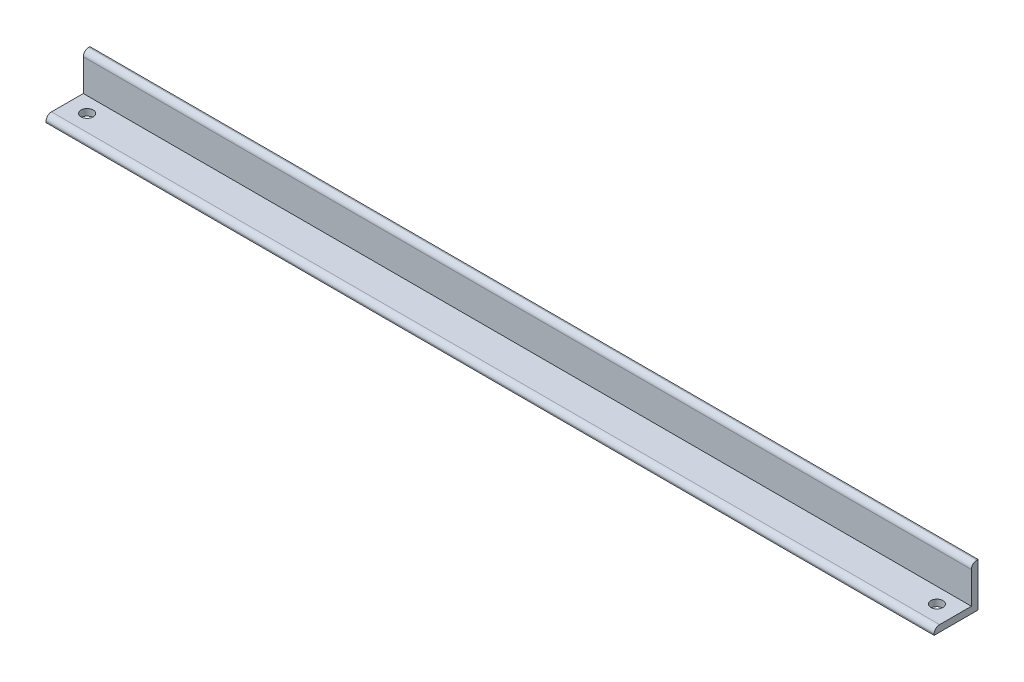
ISO-10303-21;
HEADER;
FILE_DESCRIPTION(('STEP AP214'),'2;1');
FILE_NAME('part.step','',(''),(''),'','','');
FILE_SCHEMA(('AUTOMOTIVE_DESIGN { 1 0 10303 214 1 1 1 1 }'));
ENDSEC;
DATA;
#1=APPLICATION_CONTEXT('core data for automotive mechanical design processes');
#2=APPLICATION_PROTOCOL_DEFINITION('international standard','automotive_design',2000,#1);
#3=PRODUCT_CONTEXT('',#1,'mechanical');
#4=PRODUCT('Part','Part','',(#3));
#5=PRODUCT_RELATED_PRODUCT_CATEGORY('part','',(#4));
#6=PRODUCT_DEFINITION_FORMATION('','',#4);
#7=PRODUCT_DEFINITION_CONTEXT('part definition',#1,'design');
#8=PRODUCT_DEFINITION('design','',#6,#7);
#9=PRODUCT_DEFINITION_SHAPE('','',#8);
#10=(LENGTH_UNIT() NAMED_UNIT(*) SI_UNIT(.MILLI.,.METRE.));
#11=(NAMED_UNIT(*) PLANE_ANGLE_UNIT() SI_UNIT($,.RADIAN.));
#12=(NAMED_UNIT(*) SI_UNIT($,.STERADIAN.) SOLID_ANGLE_UNIT());
#13=UNCERTAINTY_MEASURE_WITH_UNIT(LENGTH_MEASURE(1.E-05),#10,'distance_accuracy_value','');
#14=(GEOMETRIC_REPRESENTATION_CONTEXT(3) GLOBAL_UNCERTAINTY_ASSIGNED_CONTEXT((#13)) GLOBAL_UNIT_ASSIGNED_CONTEXT((#10,
#11,#12)) REPRESENTATION_CONTEXT('',''));
#15=CARTESIAN_POINT('',(0.,0.,0.));
#16=DIRECTION('',(0.,0.,1.));
#17=DIRECTION('',(1.,0.,0.));
#18=AXIS2_PLACEMENT_3D('',#15,#16,#17);
#19=CARTESIAN_POINT('',(0.,0.,80.));
#20=DIRECTION('',(1.,0.,0.));
#21=DIRECTION('',(0.,0.,-1.));
#22=AXIS2_PLACEMENT_3D('',#19,#20,#21);
#23=PLANE('',#22);
#24=DIRECTION('',(0.,-1.,0.));
#25=VECTOR('',#24,1.);
#26=CARTESIAN_POINT('',(0.,0.,80.));
#27=LINE('',#26,#25);
#28=CARTESIAN_POINT('',(0.,2.,80.));
#29=VERTEX_POINT('',#28);
#30=CARTESIAN_POINT('',(0.,0.,80.));
#31=VERTEX_POINT('',#30);
#32=EDGE_CURVE('E126',#29,#31,#27,.T.);
#33=ORIENTED_EDGE('',*,*,#32,.F.);
#34=CARTESIAN_POINT('',(0.,2.,70.));
#35=DIRECTION('',(1.,0.,0.));
#36=DIRECTION('',(0.,0.,-1.));
#37=AXIS2_PLACEMENT_3D('',#34,#35,#36);
#38=CIRCLE('',#37,10.);
#39=CARTESIAN_POINT('',(0.,12.,70.));
#40=VERTEX_POINT('',#39);
#41=EDGE_CURVE('E158',#29,#40,#38,.F.);
#42=ORIENTED_EDGE('',*,*,#41,.T.);
#43=DIRECTION('',(0.,0.,1.));
#44=VECTOR('',#43,1.);
#45=CARTESIAN_POINT('',(0.,12.,12.));
#46=LINE('',#45,#44);
#47=CARTESIAN_POINT('',(0.,12.,12.));
#48=VERTEX_POINT('',#47);
#49=EDGE_CURVE('E105',#48,#40,#46,.T.);
#50=ORIENTED_EDGE('',*,*,#49,.F.);
#51=DIRECTION('',(0.,-1.,0.));
#52=VECTOR('',#51,1.);
#53=CARTESIAN_POINT('',(0.,80.,12.));
#54=LINE('',#53,#52);
#55=CARTESIAN_POINT('',(0.,70.,12.));
#56=VERTEX_POINT('',#55);
#57=EDGE_CURVE('E111',#56,#48,#54,.T.);
#58=ORIENTED_EDGE('',*,*,#57,.F.);
#59=CARTESIAN_POINT('',(0.,70.,2.));
#60=DIRECTION('',(1.,0.,0.));
#61=DIRECTION('',(0.,0.,-1.));
#62=AXIS2_PLACEMENT_3D('',#59,#60,#61);
#63=CIRCLE('',#62,10.);
#64=CARTESIAN_POINT('',(0.,80.,2.));
#65=VERTEX_POINT('',#64);
#66=EDGE_CURVE('E156',#56,#65,#63,.F.);
#67=ORIENTED_EDGE('',*,*,#66,.T.);
#68=DIRECTION('',(0.,0.,-1.));
#69=VECTOR('',#68,1.);
#70=CARTESIAN_POINT('',(0.,80.,80.));
#71=LINE('',#70,#69);
#72=CARTESIAN_POINT('',(0.,80.,0.));
#73=VERTEX_POINT('',#72);
#74=EDGE_CURVE('E134',#65,#73,#71,.T.);
#75=ORIENTED_EDGE('',*,*,#74,.T.);
#76=DIRECTION('',(0.,-1.,0.));
#77=VECTOR('',#76,1.);
#78=CARTESIAN_POINT('',(0.,0.,0.));
#79=LINE('',#78,#77);
#80=CARTESIAN_POINT('',(0.,0.,0.));
#81=VERTEX_POINT('',#80);
#82=EDGE_CURVE('E115',#73,#81,#79,.T.);
#83=ORIENTED_EDGE('',*,*,#82,.T.);
#84=DIRECTION('',(0.,0.,-1.));
#85=VECTOR('',#84,1.);
#86=CARTESIAN_POINT('',(0.,0.,80.));
#87=LINE('',#86,#85);
#88=EDGE_CURVE('E150',#31,#81,#87,.T.);
#89=ORIENTED_EDGE('',*,*,#88,.F.);
#90=EDGE_LOOP('',(#33,#42,#50,#58,#67,#75,#83,#89));
#91=FACE_BOUND('',#90,.T.);
#92=ADVANCED_FACE('F32',(#91),#23,.F.);
#93=CARTESIAN_POINT('',(0.,0.,80.));
#94=DIRECTION('',(0.,1.,0.));
#95=DIRECTION('',(0.,0.,1.));
#96=AXIS2_PLACEMENT_3D('',#93,#94,#95);
#97=PLANE('',#96);
#98=CARTESIAN_POINT('',(1584.01258871579,0.,40.));
#99=DIRECTION('',(0.,-1.,0.));
#100=DIRECTION('',(0.,0.,-1.));
#101=AXIS2_PLACEMENT_3D('',#98,#99,#100);
#102=CIRCLE('',#101,11.);
#103=CARTESIAN_POINT('',(1584.01258871579,0.,29.));
#104=VERTEX_POINT('',#103);
#105=EDGE_CURVE('E172',#104,#104,#102,.T.);
#106=ORIENTED_EDGE('',*,*,#105,.F.);
#107=EDGE_LOOP('',(#106));
#108=FACE_BOUND('',#107,.T.);
#109=CARTESIAN_POINT('',(35.,0.,40.));
#110=DIRECTION('',(0.,-1.,0.));
#111=DIRECTION('',(0.,0.,-1.));
#112=AXIS2_PLACEMENT_3D('',#109,#110,#111);
#113=CIRCLE('',#112,11.);
#114=CARTESIAN_POINT('',(35.,0.,29.));
#115=VERTEX_POINT('',#114);
#116=EDGE_CURVE('E165',#115,#115,#113,.T.);
#117=ORIENTED_EDGE('',*,*,#116,.F.);
#118=EDGE_LOOP('',(#117));
#119=FACE_BOUND('',#118,.T.);
#120=DIRECTION('',(1.,0.,0.));
#121=VECTOR('',#120,1.);
#122=CARTESIAN_POINT('',(0.,0.,0.));
#123=LINE('',#122,#121);
#124=CARTESIAN_POINT('',(1619.,0.,0.));
#125=VERTEX_POINT('',#124);
#126=EDGE_CURVE('E137',#81,#125,#123,.T.);
#127=ORIENTED_EDGE('',*,*,#126,.T.);
#128=DIRECTION('',(0.,0.,-1.));
#129=VECTOR('',#128,1.);
#130=CARTESIAN_POINT('',(1619.,0.,80.));
#131=LINE('',#130,#129);
#132=CARTESIAN_POINT('',(1619.,0.,80.));
#133=VERTEX_POINT('',#132);
#134=EDGE_CURVE('E147',#133,#125,#131,.T.);
#135=ORIENTED_EDGE('',*,*,#134,.F.);
#136=DIRECTION('',(1.,0.,0.));
#137=VECTOR('',#136,1.);
#138=CARTESIAN_POINT('',(0.,0.,80.));
#139=LINE('',#138,#137);
#140=EDGE_CURVE('E128',#31,#133,#139,.T.);
#141=ORIENTED_EDGE('',*,*,#140,.F.);
#142=ORIENTED_EDGE('',*,*,#88,.T.);
#143=EDGE_LOOP('',(#127,#135,#141,#142));
#144=FACE_BOUND('',#143,.T.);
#145=ADVANCED_FACE('F180',(#108,#119,#144),#97,.F.);
#146=CARTESIAN_POINT('',(1619.,0.,80.));
#147=DIRECTION('',(-1.,0.,0.));
#148=DIRECTION('',(0.,0.,1.));
#149=AXIS2_PLACEMENT_3D('',#146,#147,#148);
#150=PLANE('',#149);
#151=DIRECTION('',(0.,0.,1.));
#152=VECTOR('',#151,1.);
#153=CARTESIAN_POINT('',(1619.,12.,12.));
#154=LINE('',#153,#152);
#155=CARTESIAN_POINT('',(1619.,12.,12.));
#156=VERTEX_POINT('',#155);
#157=CARTESIAN_POINT('',(1619.,12.,70.));
#158=VERTEX_POINT('',#157);
#159=EDGE_CURVE('E100',#156,#158,#154,.T.);
#160=ORIENTED_EDGE('',*,*,#159,.T.);
#161=CARTESIAN_POINT('',(1619.,2.,70.));
#162=DIRECTION('',(-1.,0.,0.));
#163=DIRECTION('',(0.,0.,1.));
#164=AXIS2_PLACEMENT_3D('',#161,#162,#163);
#165=CIRCLE('',#164,10.);
#166=CARTESIAN_POINT('',(1619.,2.,80.));
#167=VERTEX_POINT('',#166);
#168=EDGE_CURVE('E162',#158,#167,#165,.F.);
#169=ORIENTED_EDGE('',*,*,#168,.T.);
#170=DIRECTION('',(0.,1.,0.));
#171=VECTOR('',#170,1.);
#172=CARTESIAN_POINT('',(1619.,0.,80.));
#173=LINE('',#172,#171);
#174=EDGE_CURVE('E131',#133,#167,#173,.T.);
#175=ORIENTED_EDGE('',*,*,#174,.F.);
#176=ORIENTED_EDGE('',*,*,#134,.T.);
#177=DIRECTION('',(0.,1.,0.));
#178=VECTOR('',#177,1.);
#179=CARTESIAN_POINT('',(1619.,0.,0.));
#180=LINE('',#179,#178);
#181=CARTESIAN_POINT('',(1619.,80.,0.));
#182=VERTEX_POINT('',#181);
#183=EDGE_CURVE('E139',#125,#182,#180,.T.);
#184=ORIENTED_EDGE('',*,*,#183,.T.);
#185=DIRECTION('',(0.,0.,-1.));
#186=VECTOR('',#185,1.);
#187=CARTESIAN_POINT('',(1619.,80.,80.));
#188=LINE('',#187,#186);
#189=CARTESIAN_POINT('',(1619.,80.,2.));
#190=VERTEX_POINT('',#189);
#191=EDGE_CURVE('E145',#190,#182,#188,.T.);
#192=ORIENTED_EDGE('',*,*,#191,.F.);
#193=CARTESIAN_POINT('',(1619.,70.,2.));
#194=DIRECTION('',(-1.,0.,0.));
#195=DIRECTION('',(0.,0.,1.));
#196=AXIS2_PLACEMENT_3D('',#193,#194,#195);
#197=CIRCLE('',#196,10.);
#198=CARTESIAN_POINT('',(1619.,70.,12.));
#199=VERTEX_POINT('',#198);
#200=EDGE_CURVE('E49',#190,#199,#197,.F.);
#201=ORIENTED_EDGE('',*,*,#200,.T.);
#202=DIRECTION('',(0.,-1.,0.));
#203=VECTOR('',#202,1.);
#204=CARTESIAN_POINT('',(1619.,80.,12.));
#205=LINE('',#204,#203);
#206=EDGE_CURVE('E96',#199,#156,#205,.T.);
#207=ORIENTED_EDGE('',*,*,#206,.T.);
#208=EDGE_LOOP('',(#160,#169,#175,#176,#184,#192,#201,#207));
#209=FACE_BOUND('',#208,.T.);
#210=ADVANCED_FACE('F98',(#209),#150,.F.);
#211=CARTESIAN_POINT('',(0.,80.,80.));
#212=DIRECTION('',(0.,-1.,0.));
#213=DIRECTION('',(0.,0.,-1.));
#214=AXIS2_PLACEMENT_3D('',#211,#212,#213);
#215=PLANE('',#214);
#216=ORIENTED_EDGE('',*,*,#74,.F.);
#217=DIRECTION('',(-1.,0.,0.));
#218=VECTOR('',#217,1.);
#219=CARTESIAN_POINT('',(0.,80.,2.));
#220=LINE('',#219,#218);
#221=EDGE_CURVE('E11',#65,#190,#220,.F.);
#222=ORIENTED_EDGE('',*,*,#221,.T.);
#223=ORIENTED_EDGE('',*,*,#191,.T.);
#224=DIRECTION('',(-1.,0.,0.));
#225=VECTOR('',#224,1.);
#226=CARTESIAN_POINT('',(0.,80.,0.));
#227=LINE('',#226,#225);
#228=EDGE_CURVE('E129',#182,#73,#227,.T.);
#229=ORIENTED_EDGE('',*,*,#228,.T.);
#230=EDGE_LOOP('',(#216,#222,#223,#229));
#231=FACE_BOUND('',#230,.T.);
#232=ADVANCED_FACE('F194',(#231),#215,.F.);
#233=CARTESIAN_POINT('',(0.,80.,80.));
#234=DIRECTION('',(0.,0.,-1.));
#235=DIRECTION('',(-1.,0.,0.));
#236=AXIS2_PLACEMENT_3D('',#233,#234,#235);
#237=PLANE('',#236);
#238=ORIENTED_EDGE('',*,*,#174,.T.);
#239=DIRECTION('',(-1.,0.,0.));
#240=VECTOR('',#239,1.);
#241=CARTESIAN_POINT('',(0.,2.,80.));
#242=LINE('',#241,#240);
#243=EDGE_CURVE('E153',#167,#29,#242,.T.);
#244=ORIENTED_EDGE('',*,*,#243,.T.);
#245=ORIENTED_EDGE('',*,*,#32,.T.);
#246=ORIENTED_EDGE('',*,*,#140,.T.);
#247=EDGE_LOOP('',(#238,#244,#245,#246));
#248=FACE_BOUND('',#247,.T.);
#249=ADVANCED_FACE('F202',(#248),#237,.F.);
#250=CARTESIAN_POINT('',(0.,80.,0.));
#251=DIRECTION('',(0.,0.,-1.));
#252=DIRECTION('',(-1.,0.,0.));
#253=AXIS2_PLACEMENT_3D('',#250,#251,#252);
#254=PLANE('',#253);
#255=ORIENTED_EDGE('',*,*,#82,.F.);
#256=ORIENTED_EDGE('',*,*,#228,.F.);
#257=ORIENTED_EDGE('',*,*,#183,.F.);
#258=ORIENTED_EDGE('',*,*,#126,.F.);
#259=EDGE_LOOP('',(#255,#256,#257,#258));
#260=FACE_BOUND('',#259,.T.);
#261=ADVANCED_FACE('F193',(#260),#254,.T.);
#262=CARTESIAN_POINT('',(1619.,80.,12.));
#263=DIRECTION('',(0.,0.,-1.));
#264=DIRECTION('',(0.,1.,0.));
#265=AXIS2_PLACEMENT_3D('',#262,#263,#264);
#266=PLANE('',#265);
#267=ORIENTED_EDGE('',*,*,#206,.F.);
#268=DIRECTION('',(-1.,0.,0.));
#269=VECTOR('',#268,1.);
#270=CARTESIAN_POINT('',(1619.,70.,12.));
#271=LINE('',#270,#269);
#272=EDGE_CURVE('E41',#199,#56,#271,.T.);
#273=ORIENTED_EDGE('',*,*,#272,.T.);
#274=ORIENTED_EDGE('',*,*,#57,.T.);
#275=DIRECTION('',(-1.,0.,0.));
#276=VECTOR('',#275,1.);
#277=CARTESIAN_POINT('',(1619.,12.,12.));
#278=LINE('',#277,#276);
#279=EDGE_CURVE('E108',#156,#48,#278,.T.);
#280=ORIENTED_EDGE('',*,*,#279,.F.);
#281=EDGE_LOOP('',(#267,#273,#274,#280));
#282=FACE_BOUND('',#281,.T.);
#283=ADVANCED_FACE('F109',(#282),#266,.F.);
#284=CARTESIAN_POINT('',(1619.,12.,12.));
#285=DIRECTION('',(0.,-1.,0.));
#286=DIRECTION('',(0.,0.,-1.));
#287=AXIS2_PLACEMENT_3D('',#284,#285,#286);
#288=PLANE('',#287);
#289=CARTESIAN_POINT('',(1584.01258871579,12.,40.));
#290=DIRECTION('',(0.,-1.,0.));
#291=DIRECTION('',(0.,0.,-1.));
#292=AXIS2_PLACEMENT_3D('',#289,#290,#291);
#293=CIRCLE('',#292,11.);
#294=CARTESIAN_POINT('',(1584.01258871579,12.,29.));
#295=VERTEX_POINT('',#294);
#296=EDGE_CURVE('E36',#295,#295,#293,.T.);
#297=ORIENTED_EDGE('',*,*,#296,.T.);
#298=EDGE_LOOP('',(#297));
#299=FACE_BOUND('',#298,.T.);
#300=CARTESIAN_POINT('',(35.,12.,40.));
#301=DIRECTION('',(0.,-1.,0.));
#302=DIRECTION('',(0.,0.,-1.));
#303=AXIS2_PLACEMENT_3D('',#300,#301,#302);
#304=CIRCLE('',#303,11.);
#305=CARTESIAN_POINT('',(35.,12.,29.));
#306=VERTEX_POINT('',#305);
#307=EDGE_CURVE('E124',#306,#306,#304,.T.);
#308=ORIENTED_EDGE('',*,*,#307,.T.);
#309=EDGE_LOOP('',(#308));
#310=FACE_BOUND('',#309,.T.);
#311=ORIENTED_EDGE('',*,*,#49,.T.);
#312=DIRECTION('',(-1.,0.,0.));
#313=VECTOR('',#312,1.);
#314=CARTESIAN_POINT('',(1619.,12.,70.));
#315=LINE('',#314,#313);
#316=EDGE_CURVE('E119',#40,#158,#315,.F.);
#317=ORIENTED_EDGE('',*,*,#316,.T.);
#318=ORIENTED_EDGE('',*,*,#159,.F.);
#319=ORIENTED_EDGE('',*,*,#279,.T.);
#320=EDGE_LOOP('',(#311,#317,#318,#319));
#321=FACE_BOUND('',#320,.T.);
#322=ADVANCED_FACE('F117',(#299,#310,#321),#288,.F.);
#323=CARTESIAN_POINT('',(0.,2.,70.));
#324=DIRECTION('',(-1.,0.,0.));
#325=DIRECTION('',(0.,0.,1.));
#326=AXIS2_PLACEMENT_3D('',#323,#324,#325);
#327=CYLINDRICAL_SURFACE('',#326,10.);
#328=ORIENTED_EDGE('',*,*,#168,.F.);
#329=ORIENTED_EDGE('',*,*,#316,.F.);
#330=ORIENTED_EDGE('',*,*,#41,.F.);
#331=ORIENTED_EDGE('',*,*,#243,.F.);
#332=EDGE_LOOP('',(#328,#329,#330,#331));
#333=FACE_BOUND('',#332,.T.);
#334=ADVANCED_FACE('F199',(#333),#327,.T.);
#335=CARTESIAN_POINT('',(1619.,70.,2.));
#336=DIRECTION('',(-1.,0.,0.));
#337=DIRECTION('',(0.,0.,1.));
#338=AXIS2_PLACEMENT_3D('',#335,#336,#337);
#339=CYLINDRICAL_SURFACE('',#338,10.);
#340=ORIENTED_EDGE('',*,*,#200,.F.);
#341=ORIENTED_EDGE('',*,*,#221,.F.);
#342=ORIENTED_EDGE('',*,*,#66,.F.);
#343=ORIENTED_EDGE('',*,*,#272,.F.);
#344=EDGE_LOOP('',(#340,#341,#342,#343));
#345=FACE_BOUND('',#344,.T.);
#346=ADVANCED_FACE('F34',(#345),#339,.T.);
#347=CARTESIAN_POINT('',(35.,80.,40.));
#348=DIRECTION('',(0.,-1.,0.));
#349=DIRECTION('',(0.,0.,-1.));
#350=AXIS2_PLACEMENT_3D('',#347,#348,#349);
#351=CYLINDRICAL_SURFACE('',#350,11.);
#352=ORIENTED_EDGE('',*,*,#116,.T.);
#353=EDGE_LOOP('',(#352));
#354=FACE_BOUND('',#353,.T.);
#355=ORIENTED_EDGE('',*,*,#307,.F.);
#356=EDGE_LOOP('',(#355));
#357=FACE_BOUND('',#356,.T.);
#358=ADVANCED_FACE('F222',(#354,#357),#351,.F.);
#359=CARTESIAN_POINT('',(1584.01258871579,80.,40.));
#360=DIRECTION('',(0.,-1.,0.));
#361=DIRECTION('',(0.,0.,-1.));
#362=AXIS2_PLACEMENT_3D('',#359,#360,#361);
#363=CYLINDRICAL_SURFACE('',#362,11.);
#364=ORIENTED_EDGE('',*,*,#105,.T.);
#365=EDGE_LOOP('',(#364));
#366=FACE_BOUND('',#365,.T.);
#367=ORIENTED_EDGE('',*,*,#296,.F.);
#368=EDGE_LOOP('',(#367));
#369=FACE_BOUND('',#368,.T.);
#370=ADVANCED_FACE('F177',(#366,#369),#363,.F.);
#371=CLOSED_SHELL('',(#92,#145,#210,#232,#249,#261,#283,#322,#334,#346,#358,#370));
#372=MANIFOLD_SOLID_BREP('B2',#371);
#373=ADVANCED_BREP_SHAPE_REPRESENTATION('',(#18,#372),#14);
#374=SHAPE_DEFINITION_REPRESENTATION(#9,#373);
ENDSEC;
END-ISO-10303-21;
